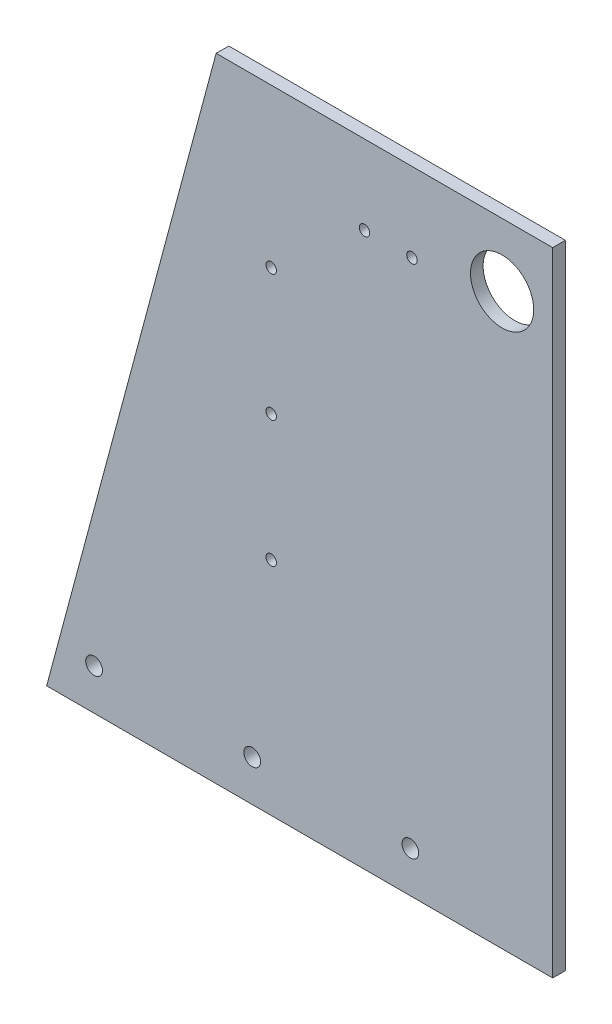
ISO-10303-21;
HEADER;
FILE_DESCRIPTION(('STEP AP214'),'2;1');
FILE_NAME('part.step','',(''),(''),'','','');
FILE_SCHEMA(('AUTOMOTIVE_DESIGN { 1 0 10303 214 1 1 1 1 }'));
ENDSEC;
DATA;
#1=APPLICATION_CONTEXT('core data for automotive mechanical design processes');
#2=APPLICATION_PROTOCOL_DEFINITION('international standard','automotive_design',2000,#1);
#3=PRODUCT_CONTEXT('',#1,'mechanical');
#4=PRODUCT('Part','Part','',(#3));
#5=PRODUCT_RELATED_PRODUCT_CATEGORY('part','',(#4));
#6=PRODUCT_DEFINITION_FORMATION('','',#4);
#7=PRODUCT_DEFINITION_CONTEXT('part definition',#1,'design');
#8=PRODUCT_DEFINITION('design','',#6,#7);
#9=PRODUCT_DEFINITION_SHAPE('','',#8);
#10=(LENGTH_UNIT() NAMED_UNIT(*) SI_UNIT(.MILLI.,.METRE.));
#11=(NAMED_UNIT(*) PLANE_ANGLE_UNIT() SI_UNIT($,.RADIAN.));
#12=(NAMED_UNIT(*) SI_UNIT($,.STERADIAN.) SOLID_ANGLE_UNIT());
#13=UNCERTAINTY_MEASURE_WITH_UNIT(LENGTH_MEASURE(1.E-05),#10,'distance_accuracy_value','');
#14=(GEOMETRIC_REPRESENTATION_CONTEXT(3) GLOBAL_UNCERTAINTY_ASSIGNED_CONTEXT((#13)) GLOBAL_UNIT_ASSIGNED_CONTEXT((#10,
#11,#12)) REPRESENTATION_CONTEXT('',''));
#15=CARTESIAN_POINT('',(0.,0.,0.));
#16=DIRECTION('',(0.,0.,1.));
#17=DIRECTION('',(1.,0.,0.));
#18=AXIS2_PLACEMENT_3D('',#15,#16,#17);
#19=CARTESIAN_POINT('',(80.,0.,4.));
#20=DIRECTION('',(1.,0.,0.));
#21=DIRECTION('',(0.,1.,0.));
#22=AXIS2_PLACEMENT_3D('',#19,#20,#21);
#23=PLANE('',#22);
#24=DIRECTION('',(0.,-1.,0.));
#25=VECTOR('',#24,1.);
#26=CARTESIAN_POINT('',(80.,0.,0.));
#27=LINE('',#26,#25);
#28=CARTESIAN_POINT('',(80.,100.,0.));
#29=VERTEX_POINT('',#28);
#30=CARTESIAN_POINT('',(80.,-100.,0.));
#31=VERTEX_POINT('',#30);
#32=EDGE_CURVE('E136',#29,#31,#27,.T.);
#33=ORIENTED_EDGE('',*,*,#32,.F.);
#34=DIRECTION('',(0.,0.,-1.));
#35=VECTOR('',#34,1.);
#36=CARTESIAN_POINT('',(80.,100.,4.));
#37=LINE('',#36,#35);
#38=CARTESIAN_POINT('',(80.,100.,4.));
#39=VERTEX_POINT('',#38);
#40=EDGE_CURVE('E11',#39,#29,#37,.T.);
#41=ORIENTED_EDGE('',*,*,#40,.F.);
#42=DIRECTION('',(0.,-1.,0.));
#43=VECTOR('',#42,1.);
#44=CARTESIAN_POINT('',(80.,0.,4.));
#45=LINE('',#44,#43);
#46=CARTESIAN_POINT('',(80.,-100.,4.));
#47=VERTEX_POINT('',#46);
#48=EDGE_CURVE('E102',#39,#47,#45,.T.);
#49=ORIENTED_EDGE('',*,*,#48,.T.);
#50=DIRECTION('',(0.,0.,-1.));
#51=VECTOR('',#50,1.);
#52=CARTESIAN_POINT('',(80.,-100.,4.));
#53=LINE('',#52,#51);
#54=EDGE_CURVE('E80',#47,#31,#53,.T.);
#55=ORIENTED_EDGE('',*,*,#54,.T.);
#56=EDGE_LOOP('',(#33,#41,#49,#55));
#57=FACE_BOUND('',#56,.T.);
#58=ADVANCED_FACE('F40',(#57),#23,.T.);
#59=CARTESIAN_POINT('',(0.,100.,4.));
#60=DIRECTION('',(0.,1.,0.));
#61=DIRECTION('',(0.,0.,1.));
#62=AXIS2_PLACEMENT_3D('',#59,#60,#61);
#63=PLANE('',#62);
#64=DIRECTION('',(1.,0.,0.));
#65=VECTOR('',#64,1.);
#66=CARTESIAN_POINT('',(0.,100.,0.));
#67=LINE('',#66,#65);
#68=CARTESIAN_POINT('',(-26.4101615137746,100.,0.));
#69=VERTEX_POINT('',#68);
#70=EDGE_CURVE('E92',#69,#29,#67,.T.);
#71=ORIENTED_EDGE('',*,*,#70,.F.);
#72=DIRECTION('',(0.,0.,-1.));
#73=VECTOR('',#72,1.);
#74=CARTESIAN_POINT('',(-26.4101615137746,100.,4.));
#75=LINE('',#74,#73);
#76=CARTESIAN_POINT('',(-26.4101615137746,100.,4.));
#77=VERTEX_POINT('',#76);
#78=EDGE_CURVE('E49',#77,#69,#75,.T.);
#79=ORIENTED_EDGE('',*,*,#78,.F.);
#80=DIRECTION('',(1.,0.,0.));
#81=VECTOR('',#80,1.);
#82=CARTESIAN_POINT('',(0.,100.,4.));
#83=LINE('',#82,#81);
#84=EDGE_CURVE('E90',#77,#39,#83,.T.);
#85=ORIENTED_EDGE('',*,*,#84,.T.);
#86=ORIENTED_EDGE('',*,*,#40,.T.);
#87=EDGE_LOOP('',(#71,#79,#85,#86));
#88=FACE_BOUND('',#87,.T.);
#89=ADVANCED_FACE('F88',(#88),#63,.T.);
#90=CARTESIAN_POINT('',(-49.641016151377,13.301270189222,4.));
#91=DIRECTION('',(0.965925826289067,-0.258819045102525,0.));
#92=DIRECTION('',(0.258819045102525,0.965925826289067,0.));
#93=AXIS2_PLACEMENT_3D('',#90,#91,#92);
#94=PLANE('',#93);
#95=DIRECTION('',(-0.258819045102525,-0.965925826289067,0.));
#96=VECTOR('',#95,1.);
#97=CARTESIAN_POINT('',(-49.641016151377,13.301270189222,0.));
#98=LINE('',#97,#96);
#99=CARTESIAN_POINT('',(-80.,-100.,0.));
#100=VERTEX_POINT('',#99);
#101=EDGE_CURVE('E139',#69,#100,#98,.T.);
#102=ORIENTED_EDGE('',*,*,#101,.T.);
#103=DIRECTION('',(0.,0.,-1.));
#104=VECTOR('',#103,1.);
#105=CARTESIAN_POINT('',(-80.,-100.,4.));
#106=LINE('',#105,#104);
#107=CARTESIAN_POINT('',(-80.,-100.,4.));
#108=VERTEX_POINT('',#107);
#109=EDGE_CURVE('E95',#108,#100,#106,.T.);
#110=ORIENTED_EDGE('',*,*,#109,.F.);
#111=DIRECTION('',(-0.258819045102525,-0.965925826289067,0.));
#112=VECTOR('',#111,1.);
#113=CARTESIAN_POINT('',(-49.641016151377,13.301270189222,4.));
#114=LINE('',#113,#112);
#115=EDGE_CURVE('E97',#77,#108,#114,.T.);
#116=ORIENTED_EDGE('',*,*,#115,.F.);
#117=ORIENTED_EDGE('',*,*,#78,.T.);
#118=EDGE_LOOP('',(#102,#110,#116,#117));
#119=FACE_BOUND('',#118,.T.);
#120=ADVANCED_FACE('F98',(#119),#94,.F.);
#121=CARTESIAN_POINT('',(20.5,75.,4.));
#122=DIRECTION('',(0.,0.,-1.));
#123=DIRECTION('',(-1.,0.,0.));
#124=AXIS2_PLACEMENT_3D('',#121,#122,#123);
#125=CYLINDRICAL_SURFACE('',#124,1.65);
#126=CARTESIAN_POINT('',(20.5,75.,4.));
#127=DIRECTION('',(0.,0.,1.));
#128=DIRECTION('',(1.,0.,0.));
#129=AXIS2_PLACEMENT_3D('',#126,#127,#128);
#130=CIRCLE('',#129,1.65);
#131=CARTESIAN_POINT('',(22.15,75.,4.));
#132=VERTEX_POINT('',#131);
#133=EDGE_CURVE('E118',#132,#132,#130,.T.);
#134=ORIENTED_EDGE('',*,*,#133,.T.);
#135=EDGE_LOOP('',(#134));
#136=FACE_BOUND('',#135,.T.);
#137=CARTESIAN_POINT('',(20.5,75.,0.));
#138=DIRECTION('',(0.,0.,1.));
#139=DIRECTION('',(1.,0.,0.));
#140=AXIS2_PLACEMENT_3D('',#137,#138,#139);
#141=CIRCLE('',#140,1.65);
#142=CARTESIAN_POINT('',(22.15,75.,0.));
#143=VERTEX_POINT('',#142);
#144=EDGE_CURVE('E151',#143,#143,#141,.T.);
#145=ORIENTED_EDGE('',*,*,#144,.F.);
#146=EDGE_LOOP('',(#145));
#147=FACE_BOUND('',#146,.T.);
#148=ADVANCED_FACE('F210',(#136,#147),#125,.F.);
#149=CARTESIAN_POINT('',(-8.99999999999918,-30.,4.));
#150=DIRECTION('',(0.,0.,-1.));
#151=DIRECTION('',(-1.,0.,0.));
#152=AXIS2_PLACEMENT_3D('',#149,#150,#151);
#153=CYLINDRICAL_SURFACE('',#152,1.65000000000001);
#154=CARTESIAN_POINT('',(-8.99999999999918,-30.,4.));
#155=DIRECTION('',(0.,0.,1.));
#156=DIRECTION('',(1.,0.,0.));
#157=AXIS2_PLACEMENT_3D('',#154,#155,#156);
#158=CIRCLE('',#157,1.65000000000001);
#159=CARTESIAN_POINT('',(-7.34999999999918,-30.,4.));
#160=VERTEX_POINT('',#159);
#161=EDGE_CURVE('E115',#160,#160,#158,.T.);
#162=ORIENTED_EDGE('',*,*,#161,.T.);
#163=EDGE_LOOP('',(#162));
#164=FACE_BOUND('',#163,.T.);
#165=CARTESIAN_POINT('',(-8.99999999999918,-30.,0.));
#166=DIRECTION('',(0.,0.,1.));
#167=DIRECTION('',(1.,0.,0.));
#168=AXIS2_PLACEMENT_3D('',#165,#166,#167);
#169=CIRCLE('',#168,1.65000000000001);
#170=CARTESIAN_POINT('',(-7.34999999999918,-30.,0.));
#171=VERTEX_POINT('',#170);
#172=EDGE_CURVE('E148',#171,#171,#169,.T.);
#173=ORIENTED_EDGE('',*,*,#172,.F.);
#174=EDGE_LOOP('',(#173));
#175=FACE_BOUND('',#174,.T.);
#176=ADVANCED_FACE('F213',(#164,#175),#153,.F.);
#177=CARTESIAN_POINT('',(-8.9999999999996,10.,4.));
#178=DIRECTION('',(0.,0.,-1.));
#179=DIRECTION('',(-1.,0.,0.));
#180=AXIS2_PLACEMENT_3D('',#177,#178,#179);
#181=CYLINDRICAL_SURFACE('',#180,1.65);
#182=CARTESIAN_POINT('',(-8.9999999999996,10.,4.));
#183=DIRECTION('',(0.,0.,1.));
#184=DIRECTION('',(1.,0.,0.));
#185=AXIS2_PLACEMENT_3D('',#182,#183,#184);
#186=CIRCLE('',#185,1.65);
#187=CARTESIAN_POINT('',(-7.3499999999996,10.,4.));
#188=VERTEX_POINT('',#187);
#189=EDGE_CURVE('E112',#188,#188,#186,.T.);
#190=ORIENTED_EDGE('',*,*,#189,.T.);
#191=EDGE_LOOP('',(#190));
#192=FACE_BOUND('',#191,.T.);
#193=CARTESIAN_POINT('',(-8.9999999999996,10.,0.));
#194=DIRECTION('',(0.,0.,1.));
#195=DIRECTION('',(1.,0.,0.));
#196=AXIS2_PLACEMENT_3D('',#193,#194,#195);
#197=CIRCLE('',#196,1.65);
#198=CARTESIAN_POINT('',(-7.3499999999996,10.,0.));
#199=VERTEX_POINT('',#198);
#200=EDGE_CURVE('E145',#199,#199,#197,.T.);
#201=ORIENTED_EDGE('',*,*,#200,.F.);
#202=EDGE_LOOP('',(#201));
#203=FACE_BOUND('',#202,.T.);
#204=ADVANCED_FACE('F217',(#192,#203),#181,.F.);
#205=CARTESIAN_POINT('',(-9.00000000000001,50.,4.));
#206=DIRECTION('',(0.,0.,-1.));
#207=DIRECTION('',(-1.,0.,0.));
#208=AXIS2_PLACEMENT_3D('',#205,#206,#207);
#209=CYLINDRICAL_SURFACE('',#208,1.65);
#210=CARTESIAN_POINT('',(-9.00000000000001,50.,4.));
#211=DIRECTION('',(0.,0.,1.));
#212=DIRECTION('',(1.,0.,0.));
#213=AXIS2_PLACEMENT_3D('',#210,#211,#212);
#214=CIRCLE('',#213,1.65);
#215=CARTESIAN_POINT('',(-7.35000000000002,50.,4.));
#216=VERTEX_POINT('',#215);
#217=EDGE_CURVE('E109',#216,#216,#214,.T.);
#218=ORIENTED_EDGE('',*,*,#217,.T.);
#219=EDGE_LOOP('',(#218));
#220=FACE_BOUND('',#219,.T.);
#221=CARTESIAN_POINT('',(-9.00000000000001,50.,0.));
#222=DIRECTION('',(0.,0.,1.));
#223=DIRECTION('',(1.,0.,0.));
#224=AXIS2_PLACEMENT_3D('',#221,#222,#223);
#225=CIRCLE('',#224,1.65);
#226=CARTESIAN_POINT('',(-7.35000000000002,50.,0.));
#227=VERTEX_POINT('',#226);
#228=EDGE_CURVE('E142',#227,#227,#225,.T.);
#229=ORIENTED_EDGE('',*,*,#228,.F.);
#230=EDGE_LOOP('',(#229));
#231=FACE_BOUND('',#230,.T.);
#232=ADVANCED_FACE('F221',(#220,#231),#209,.F.);
#233=CARTESIAN_POINT('',(0.,-100.,4.));
#234=DIRECTION('',(0.,1.,0.));
#235=DIRECTION('',(0.,0.,1.));
#236=AXIS2_PLACEMENT_3D('',#233,#234,#235);
#237=PLANE('',#236);
#238=DIRECTION('',(1.,0.,0.));
#239=VECTOR('',#238,1.);
#240=CARTESIAN_POINT('',(0.,-100.,0.));
#241=LINE('',#240,#239);
#242=EDGE_CURVE('E73',#100,#31,#241,.T.);
#243=ORIENTED_EDGE('',*,*,#242,.T.);
#244=ORIENTED_EDGE('',*,*,#54,.F.);
#245=DIRECTION('',(1.,0.,0.));
#246=VECTOR('',#245,1.);
#247=CARTESIAN_POINT('',(0.,-100.,4.));
#248=LINE('',#247,#246);
#249=EDGE_CURVE('E57',#108,#47,#248,.T.);
#250=ORIENTED_EDGE('',*,*,#249,.F.);
#251=ORIENTED_EDGE('',*,*,#109,.T.);
#252=EDGE_LOOP('',(#243,#244,#250,#251));
#253=FACE_BOUND('',#252,.T.);
#254=ADVANCED_FACE('F160',(#253),#237,.F.);
#255=CARTESIAN_POINT('',(64.,80.,4.));
#256=DIRECTION('',(0.,0.,-1.));
#257=DIRECTION('',(-1.,0.,0.));
#258=AXIS2_PLACEMENT_3D('',#255,#256,#257);
#259=CYLINDRICAL_SURFACE('',#258,9.99999999999999);
#260=CARTESIAN_POINT('',(64.,80.,4.));
#261=DIRECTION('',(0.,0.,1.));
#262=DIRECTION('',(1.,0.,0.));
#263=AXIS2_PLACEMENT_3D('',#260,#261,#262);
#264=CIRCLE('',#263,9.99999999999999);
#265=CARTESIAN_POINT('',(74.,80.,4.));
#266=VERTEX_POINT('',#265);
#267=EDGE_CURVE('E104',#266,#266,#264,.T.);
#268=ORIENTED_EDGE('',*,*,#267,.T.);
#269=EDGE_LOOP('',(#268));
#270=FACE_BOUND('',#269,.T.);
#271=CARTESIAN_POINT('',(64.,80.,0.));
#272=DIRECTION('',(0.,0.,1.));
#273=DIRECTION('',(1.,0.,0.));
#274=AXIS2_PLACEMENT_3D('',#271,#272,#273);
#275=CIRCLE('',#274,9.99999999999999);
#276=CARTESIAN_POINT('',(74.,80.,0.));
#277=VERTEX_POINT('',#276);
#278=EDGE_CURVE('E133',#277,#277,#275,.T.);
#279=ORIENTED_EDGE('',*,*,#278,.F.);
#280=EDGE_LOOP('',(#279));
#281=FACE_BOUND('',#280,.T.);
#282=ADVANCED_FACE('F171',(#270,#281),#259,.F.);
#283=CARTESIAN_POINT('',(-65.,-87.,4.));
#284=DIRECTION('',(0.,0.,-1.));
#285=DIRECTION('',(-1.,0.,0.));
#286=AXIS2_PLACEMENT_3D('',#283,#284,#285);
#287=CYLINDRICAL_SURFACE('',#286,2.65);
#288=CARTESIAN_POINT('',(-65.,-87.,4.));
#289=DIRECTION('',(0.,0.,1.));
#290=DIRECTION('',(1.,0.,0.));
#291=AXIS2_PLACEMENT_3D('',#288,#289,#290);
#292=CIRCLE('',#291,2.65);
#293=CARTESIAN_POINT('',(-62.35,-87.,4.));
#294=VERTEX_POINT('',#293);
#295=EDGE_CURVE('E346',#294,#294,#292,.T.);
#296=ORIENTED_EDGE('',*,*,#295,.T.);
#297=EDGE_LOOP('',(#296));
#298=FACE_BOUND('',#297,.T.);
#299=CARTESIAN_POINT('',(-65.,-87.,0.));
#300=DIRECTION('',(0.,0.,1.));
#301=DIRECTION('',(1.,0.,0.));
#302=AXIS2_PLACEMENT_3D('',#299,#300,#301);
#303=CIRCLE('',#302,2.65);
#304=CARTESIAN_POINT('',(-62.35,-87.,0.));
#305=VERTEX_POINT('',#304);
#306=EDGE_CURVE('E130',#305,#305,#303,.T.);
#307=ORIENTED_EDGE('',*,*,#306,.F.);
#308=EDGE_LOOP('',(#307));
#309=FACE_BOUND('',#308,.T.);
#310=ADVANCED_FACE('F174',(#298,#309),#287,.F.);
#311=CARTESIAN_POINT('',(-15.,-87.,4.));
#312=DIRECTION('',(0.,0.,-1.));
#313=DIRECTION('',(-1.,0.,0.));
#314=AXIS2_PLACEMENT_3D('',#311,#312,#313);
#315=CYLINDRICAL_SURFACE('',#314,2.65);
#316=CARTESIAN_POINT('',(-15.,-87.,4.));
#317=DIRECTION('',(0.,0.,1.));
#318=DIRECTION('',(1.,0.,0.));
#319=AXIS2_PLACEMENT_3D('',#316,#317,#318);
#320=CIRCLE('',#319,2.65);
#321=CARTESIAN_POINT('',(-12.35,-87.,4.));
#322=VERTEX_POINT('',#321);
#323=EDGE_CURVE('E189',#322,#322,#320,.T.);
#324=ORIENTED_EDGE('',*,*,#323,.T.);
#325=EDGE_LOOP('',(#324));
#326=FACE_BOUND('',#325,.T.);
#327=CARTESIAN_POINT('',(-15.,-87.,0.));
#328=DIRECTION('',(0.,0.,1.));
#329=DIRECTION('',(1.,0.,0.));
#330=AXIS2_PLACEMENT_3D('',#327,#328,#329);
#331=CIRCLE('',#330,2.65);
#332=CARTESIAN_POINT('',(-12.35,-87.,0.));
#333=VERTEX_POINT('',#332);
#334=EDGE_CURVE('E127',#333,#333,#331,.T.);
#335=ORIENTED_EDGE('',*,*,#334,.F.);
#336=EDGE_LOOP('',(#335));
#337=FACE_BOUND('',#336,.T.);
#338=ADVANCED_FACE('F177',(#326,#337),#315,.F.);
#339=CARTESIAN_POINT('',(35.,-87.,4.));
#340=DIRECTION('',(0.,0.,-1.));
#341=DIRECTION('',(-1.,0.,0.));
#342=AXIS2_PLACEMENT_3D('',#339,#340,#341);
#343=CYLINDRICAL_SURFACE('',#342,2.65);
#344=CARTESIAN_POINT('',(35.,-87.,4.));
#345=DIRECTION('',(0.,0.,1.));
#346=DIRECTION('',(1.,0.,0.));
#347=AXIS2_PLACEMENT_3D('',#344,#345,#346);
#348=CIRCLE('',#347,2.65);
#349=CARTESIAN_POINT('',(37.65,-87.,4.));
#350=VERTEX_POINT('',#349);
#351=EDGE_CURVE('E157',#350,#350,#348,.T.);
#352=ORIENTED_EDGE('',*,*,#351,.T.);
#353=EDGE_LOOP('',(#352));
#354=FACE_BOUND('',#353,.T.);
#355=CARTESIAN_POINT('',(35.,-87.,0.));
#356=DIRECTION('',(0.,0.,1.));
#357=DIRECTION('',(1.,0.,0.));
#358=AXIS2_PLACEMENT_3D('',#355,#356,#357);
#359=CIRCLE('',#358,2.65);
#360=CARTESIAN_POINT('',(37.65,-87.,0.));
#361=VERTEX_POINT('',#360);
#362=EDGE_CURVE('E124',#361,#361,#359,.T.);
#363=ORIENTED_EDGE('',*,*,#362,.F.);
#364=EDGE_LOOP('',(#363));
#365=FACE_BOUND('',#364,.T.);
#366=ADVANCED_FACE('F42',(#354,#365),#343,.F.);
#367=CARTESIAN_POINT('',(35.5,75.,4.));
#368=DIRECTION('',(0.,0.,-1.));
#369=DIRECTION('',(-1.,0.,0.));
#370=AXIS2_PLACEMENT_3D('',#367,#368,#369);
#371=CYLINDRICAL_SURFACE('',#370,1.65);
#372=CARTESIAN_POINT('',(35.5,75.,4.));
#373=DIRECTION('',(0.,0.,1.));
#374=DIRECTION('',(1.,0.,0.));
#375=AXIS2_PLACEMENT_3D('',#372,#373,#374);
#376=CIRCLE('',#375,1.65);
#377=CARTESIAN_POINT('',(37.15,75.,4.));
#378=VERTEX_POINT('',#377);
#379=EDGE_CURVE('E121',#378,#378,#376,.F.);
#380=ORIENTED_EDGE('',*,*,#379,.F.);
#381=EDGE_LOOP('',(#380));
#382=FACE_BOUND('',#381,.T.);
#383=CARTESIAN_POINT('',(35.5,75.,0.));
#384=DIRECTION('',(0.,0.,1.));
#385=DIRECTION('',(1.,0.,0.));
#386=AXIS2_PLACEMENT_3D('',#383,#384,#385);
#387=CIRCLE('',#386,1.65);
#388=CARTESIAN_POINT('',(37.15,75.,0.));
#389=VERTEX_POINT('',#388);
#390=EDGE_CURVE('E154',#389,#389,#387,.F.);
#391=ORIENTED_EDGE('',*,*,#390,.T.);
#392=EDGE_LOOP('',(#391));
#393=FACE_BOUND('',#392,.T.);
#394=ADVANCED_FACE('F184',(#382,#393),#371,.F.);
#395=CARTESIAN_POINT('',(0.,0.,4.));
#396=DIRECTION('',(0.,0.,1.));
#397=DIRECTION('',(1.,0.,0.));
#398=AXIS2_PLACEMENT_3D('',#395,#396,#397);
#399=PLANE('',#398);
#400=ORIENTED_EDGE('',*,*,#351,.F.);
#401=EDGE_LOOP('',(#400));
#402=FACE_BOUND('',#401,.T.);
#403=ORIENTED_EDGE('',*,*,#323,.F.);
#404=EDGE_LOOP('',(#403));
#405=FACE_BOUND('',#404,.T.);
#406=ORIENTED_EDGE('',*,*,#295,.F.);
#407=EDGE_LOOP('',(#406));
#408=FACE_BOUND('',#407,.T.);
#409=ORIENTED_EDGE('',*,*,#267,.F.);
#410=EDGE_LOOP('',(#409));
#411=FACE_BOUND('',#410,.T.);
#412=ORIENTED_EDGE('',*,*,#48,.F.);
#413=ORIENTED_EDGE('',*,*,#84,.F.);
#414=ORIENTED_EDGE('',*,*,#115,.T.);
#415=ORIENTED_EDGE('',*,*,#249,.T.);
#416=EDGE_LOOP('',(#412,#413,#414,#415));
#417=FACE_BOUND('',#416,.T.);
#418=ORIENTED_EDGE('',*,*,#217,.F.);
#419=EDGE_LOOP('',(#418));
#420=FACE_BOUND('',#419,.T.);
#421=ORIENTED_EDGE('',*,*,#189,.F.);
#422=EDGE_LOOP('',(#421));
#423=FACE_BOUND('',#422,.T.);
#424=ORIENTED_EDGE('',*,*,#161,.F.);
#425=EDGE_LOOP('',(#424));
#426=FACE_BOUND('',#425,.T.);
#427=ORIENTED_EDGE('',*,*,#133,.F.);
#428=EDGE_LOOP('',(#427));
#429=FACE_BOUND('',#428,.T.);
#430=ORIENTED_EDGE('',*,*,#379,.T.);
#431=EDGE_LOOP('',(#430));
#432=FACE_BOUND('',#431,.T.);
#433=ADVANCED_FACE('F100',(#402,#405,#408,#411,#417,#420,#423,#426,#429,#432),#399,.T.);
#434=CARTESIAN_POINT('',(0.,0.,0.));
#435=DIRECTION('',(0.,0.,1.));
#436=DIRECTION('',(1.,0.,0.));
#437=AXIS2_PLACEMENT_3D('',#434,#435,#436);
#438=PLANE('',#437);
#439=ORIENTED_EDGE('',*,*,#362,.T.);
#440=EDGE_LOOP('',(#439));
#441=FACE_BOUND('',#440,.T.);
#442=ORIENTED_EDGE('',*,*,#334,.T.);
#443=EDGE_LOOP('',(#442));
#444=FACE_BOUND('',#443,.T.);
#445=ORIENTED_EDGE('',*,*,#306,.T.);
#446=EDGE_LOOP('',(#445));
#447=FACE_BOUND('',#446,.T.);
#448=ORIENTED_EDGE('',*,*,#278,.T.);
#449=EDGE_LOOP('',(#448));
#450=FACE_BOUND('',#449,.T.);
#451=ORIENTED_EDGE('',*,*,#32,.T.);
#452=ORIENTED_EDGE('',*,*,#242,.F.);
#453=ORIENTED_EDGE('',*,*,#101,.F.);
#454=ORIENTED_EDGE('',*,*,#70,.T.);
#455=EDGE_LOOP('',(#451,#452,#453,#454));
#456=FACE_BOUND('',#455,.T.);
#457=ORIENTED_EDGE('',*,*,#228,.T.);
#458=EDGE_LOOP('',(#457));
#459=FACE_BOUND('',#458,.T.);
#460=ORIENTED_EDGE('',*,*,#200,.T.);
#461=EDGE_LOOP('',(#460));
#462=FACE_BOUND('',#461,.T.);
#463=ORIENTED_EDGE('',*,*,#172,.T.);
#464=EDGE_LOOP('',(#463));
#465=FACE_BOUND('',#464,.T.);
#466=ORIENTED_EDGE('',*,*,#144,.T.);
#467=EDGE_LOOP('',(#466));
#468=FACE_BOUND('',#467,.T.);
#469=ORIENTED_EDGE('',*,*,#390,.F.);
#470=EDGE_LOOP('',(#469));
#471=FACE_BOUND('',#470,.T.);
#472=ADVANCED_FACE('F161',(#441,#444,#447,#450,#456,#459,#462,#465,#468,#471),#438,.F.);
#473=CLOSED_SHELL('',(#58,#89,#120,#148,#176,#204,#232,#254,#282,#310,#338,#366,#394,#433,#472));
#474=MANIFOLD_SOLID_BREP('B2',#473);
#475=ADVANCED_BREP_SHAPE_REPRESENTATION('',(#18,#474),#14);
#476=SHAPE_DEFINITION_REPRESENTATION(#9,#475);
ENDSEC;
END-ISO-10303-21;
